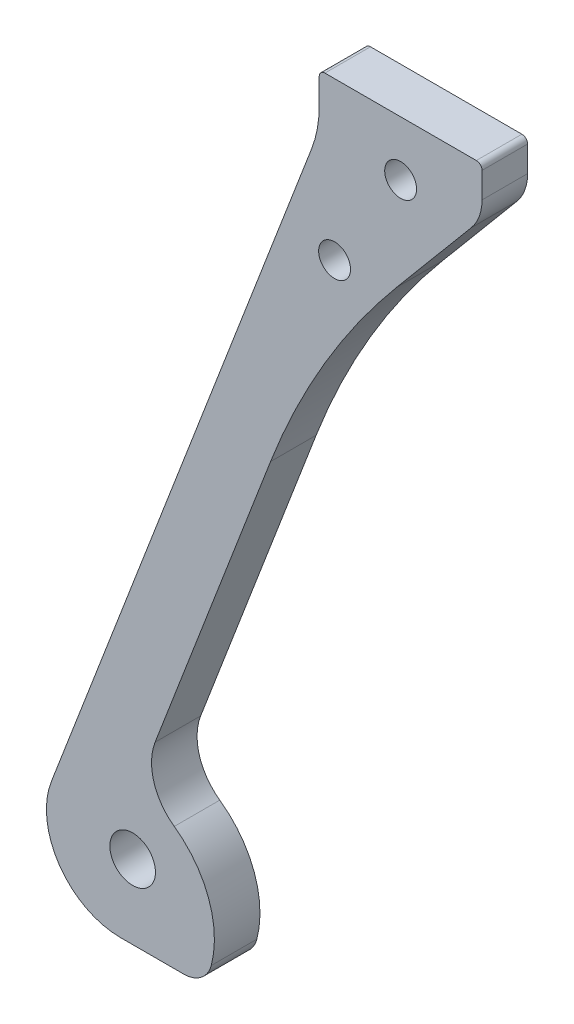
ISO-10303-21;
HEADER;
FILE_DESCRIPTION(('STEP AP214'),'2;1');
FILE_NAME('part.step','',(''),(''),'','','');
FILE_SCHEMA(('AUTOMOTIVE_DESIGN { 1 0 10303 214 1 1 1 1 }'));
ENDSEC;
DATA;
#1=APPLICATION_CONTEXT('core data for automotive mechanical design processes');
#2=APPLICATION_PROTOCOL_DEFINITION('international standard','automotive_design',2000,#1);
#3=PRODUCT_CONTEXT('',#1,'mechanical');
#4=PRODUCT('Part','Part','',(#3));
#5=PRODUCT_RELATED_PRODUCT_CATEGORY('part','',(#4));
#6=PRODUCT_DEFINITION_FORMATION('','',#4);
#7=PRODUCT_DEFINITION_CONTEXT('part definition',#1,'design');
#8=PRODUCT_DEFINITION('design','',#6,#7);
#9=PRODUCT_DEFINITION_SHAPE('','',#8);
#10=(LENGTH_UNIT() NAMED_UNIT(*) SI_UNIT(.MILLI.,.METRE.));
#11=(NAMED_UNIT(*) PLANE_ANGLE_UNIT() SI_UNIT($,.RADIAN.));
#12=(NAMED_UNIT(*) SI_UNIT($,.STERADIAN.) SOLID_ANGLE_UNIT());
#13=UNCERTAINTY_MEASURE_WITH_UNIT(LENGTH_MEASURE(1.E-05),#10,'distance_accuracy_value','');
#14=(GEOMETRIC_REPRESENTATION_CONTEXT(3) GLOBAL_UNCERTAINTY_ASSIGNED_CONTEXT((#13)) GLOBAL_UNIT_ASSIGNED_CONTEXT((#10,
#11,#12)) REPRESENTATION_CONTEXT('',''));
#15=CARTESIAN_POINT('',(0.,0.,0.));
#16=DIRECTION('',(0.,0.,1.));
#17=DIRECTION('',(1.,0.,0.));
#18=AXIS2_PLACEMENT_3D('',#15,#16,#17);
#19=CARTESIAN_POINT('',(-97.8739036875604,8.,4.));
#20=DIRECTION('',(0.,0.,1.));
#21=DIRECTION('',(1.,0.,0.));
#22=AXIS2_PLACEMENT_3D('',#19,#20,#21);
#23=PLANE('',#22);
#24=DIRECTION('',(0.,1.,0.));
#25=VECTOR('',#24,1.);
#26=CARTESIAN_POINT('',(-84.7280338220464,3.95234601413972,4.));
#27=LINE('',#26,#25);
#28=CARTESIAN_POINT('',(-84.7280338220463,-3.04765398586029,4.));
#29=VERTEX_POINT('',#28);
#30=CARTESIAN_POINT('',(-84.7280338220463,-0.799999999999999,4.));
#31=VERTEX_POINT('',#30);
#32=EDGE_CURVE('E197',#29,#31,#27,.T.);
#33=ORIENTED_EDGE('',*,*,#32,.T.);
#34=CARTESIAN_POINT('',(-85.2280338220463,-0.800000000000003,4.));
#35=DIRECTION('',(0.,0.,1.));
#36=DIRECTION('',(1.,0.,0.));
#37=AXIS2_PLACEMENT_3D('',#34,#35,#36);
#38=CIRCLE('',#37,0.5);
#39=CARTESIAN_POINT('',(-85.2280338220463,-0.300000000000003,4.));
#40=VERTEX_POINT('',#39);
#41=EDGE_CURVE('E261',#31,#40,#38,.T.);
#42=ORIENTED_EDGE('',*,*,#41,.T.);
#43=DIRECTION('',(1.,0.,0.));
#44=VECTOR('',#43,1.);
#45=CARTESIAN_POINT('',(-97.8739036875604,-0.300000000000003,4.));
#46=LINE('',#45,#44);
#47=CARTESIAN_POINT('',(-98.5197735530744,-0.300000000000003,4.));
#48=VERTEX_POINT('',#47);
#49=EDGE_CURVE('E280',#48,#40,#46,.T.);
#50=ORIENTED_EDGE('',*,*,#49,.F.);
#51=CARTESIAN_POINT('',(-98.5197735530744,-0.800000000000003,4.));
#52=DIRECTION('',(0.,0.,1.));
#53=DIRECTION('',(1.,0.,0.));
#54=AXIS2_PLACEMENT_3D('',#51,#52,#53);
#55=CIRCLE('',#54,0.5);
#56=CARTESIAN_POINT('',(-99.0197735530744,-0.799999999999999,4.));
#57=VERTEX_POINT('',#56);
#58=EDGE_CURVE('E158',#48,#57,#55,.T.);
#59=ORIENTED_EDGE('',*,*,#58,.T.);
#60=DIRECTION('',(0.,-1.,0.));
#61=VECTOR('',#60,1.);
#62=CARTESIAN_POINT('',(-99.0197735530744,3.95234601413972,4.));
#63=LINE('',#62,#61);
#64=CARTESIAN_POINT('',(-99.0197735530744,-3.04765398586029,4.));
#65=VERTEX_POINT('',#64);
#66=EDGE_CURVE('E149',#57,#65,#63,.T.);
#67=ORIENTED_EDGE('',*,*,#66,.T.);
#68=CARTESIAN_POINT('',(-109.019773553074,-3.04765398586029,4.));
#69=DIRECTION('',(0.,0.,-1.));
#70=DIRECTION('',(-1.,0.,0.));
#71=AXIS2_PLACEMENT_3D('',#68,#69,#70);
#72=CIRCLE('',#71,10.);
#73=CARTESIAN_POINT('',(-99.6839692881024,-6.6313334813133,4.));
#74=VERTEX_POINT('',#73);
#75=EDGE_CURVE('E154',#65,#74,#72,.T.);
#76=ORIENTED_EDGE('',*,*,#75,.T.);
#77=DIRECTION('',(-0.358367949545301,-0.933580426497202,0.));
#78=VECTOR('',#77,1.);
#79=CARTESIAN_POINT('',(-99.6839692881024,-6.6313334813133,4.));
#80=LINE('',#79,#78);
#81=CARTESIAN_POINT('',(-122.538955573817,-66.1706083279555,4.));
#82=VERTEX_POINT('',#81);
#83=EDGE_CURVE('E175',#74,#82,#80,.T.);
#84=ORIENTED_EDGE('',*,*,#83,.T.);
#85=CARTESIAN_POINT('',(-116.470682801585,-68.5,4.));
#86=DIRECTION('',(0.,0.,1.));
#87=DIRECTION('',(1.,0.,0.));
#88=AXIS2_PLACEMENT_3D('',#85,#86,#87);
#89=CIRCLE('',#88,6.5);
#90=CARTESIAN_POINT('',(-116.470682801585,-75.,4.));
#91=VERTEX_POINT('',#90);
#92=EDGE_CURVE('E177',#82,#91,#89,.T.);
#93=ORIENTED_EDGE('',*,*,#92,.T.);
#94=DIRECTION('',(1.,0.,0.));
#95=VECTOR('',#94,1.);
#96=CARTESIAN_POINT('',(-116.470682801585,-75.,4.));
#97=LINE('',#96,#95);
#98=CARTESIAN_POINT('',(-110.913984241029,-75.,4.));
#99=VERTEX_POINT('',#98);
#100=EDGE_CURVE('E182',#91,#99,#97,.T.);
#101=ORIENTED_EDGE('',*,*,#100,.T.);
#102=CARTESIAN_POINT('',(-110.913984241029,-72.5,4.));
#103=DIRECTION('',(0.,0.,1.));
#104=DIRECTION('',(1.,0.,0.));
#105=AXIS2_PLACEMENT_3D('',#102,#103,#104);
#106=CIRCLE('',#105,2.5);
#107=CARTESIAN_POINT('',(-108.495917326665,-73.134785316199,4.));
#108=VERTEX_POINT('',#107);
#109=EDGE_CURVE('E184',#99,#108,#106,.T.);
#110=ORIENTED_EDGE('',*,*,#109,.T.);
#111=CARTESIAN_POINT('',(-116.586415863519,-71.0108864110785,4.));
#112=DIRECTION('',(0.,0.,1.));
#113=DIRECTION('',(-1.,0.,0.));
#114=AXIS2_PLACEMENT_3D('',#111,#112,#113);
#115=CIRCLE('',#114,8.36463466829238);
#116=CARTESIAN_POINT('',(-111.747141559165,-64.188237560286,4.));
#117=VERTEX_POINT('',#116);
#118=EDGE_CURVE('E186',#108,#117,#115,.T.);
#119=ORIENTED_EDGE('',*,*,#118,.T.);
#120=CARTESIAN_POINT('',(-109.005459932499,-60.3228788674377,4.));
#121=DIRECTION('',(0.,0.,-1.));
#122=DIRECTION('',(1.,0.,0.));
#123=AXIS2_PLACEMENT_3D('',#120,#121,#122);
#124=CIRCLE('',#123,4.73896781655823);
#125=CARTESIAN_POINT('',(-113.429667527838,-58.6245846880566,4.));
#126=VERTEX_POINT('',#125);
#127=EDGE_CURVE('E188',#117,#126,#124,.T.);
#128=ORIENTED_EDGE('',*,*,#127,.T.);
#129=DIRECTION('',(0.3583679495453,0.933580426497202,0.));
#130=VECTOR('',#129,1.);
#131=CARTESIAN_POINT('',(-99.3383388404281,-21.9154184174788,4.));
#132=LINE('',#131,#130);
#133=CARTESIAN_POINT('',(-103.296373867841,-32.2264521850663,4.));
#134=VERTEX_POINT('',#133);
#135=EDGE_CURVE('E190',#126,#134,#132,.T.);
#136=ORIENTED_EDGE('',*,*,#135,.T.);
#137=CARTESIAN_POINT('',(-41.6800657190254,-55.8787368550561,4.));
#138=DIRECTION('',(0.,0.,1.));
#139=DIRECTION('',(1.,0.,0.));
#140=AXIS2_PLACEMENT_3D('',#137,#138,#139);
#141=CIRCLE('',#140,66.);
#142=CARTESIAN_POINT('',(-92.2389989648779,-13.4547546157445,4.));
#143=VERTEX_POINT('',#142);
#144=EDGE_CURVE('E255',#134,#143,#141,.F.);
#145=ORIENTED_EDGE('',*,*,#144,.T.);
#146=DIRECTION('',(0.64278760968654,0.766044443118977,0.));
#147=VECTOR('',#146,1.);
#148=CARTESIAN_POINT('',(-85.6638560495704,-5.61880442460645,4.));
#149=LINE('',#148,#147);
#150=CARTESIAN_POINT('',(-85.6638560495704,-5.61880442460646,4.));
#151=VERTEX_POINT('',#150);
#152=EDGE_CURVE('E193',#143,#151,#149,.T.);
#153=ORIENTED_EDGE('',*,*,#152,.T.);
#154=CARTESIAN_POINT('',(-88.7280338220463,-3.04765398586029,4.));
#155=DIRECTION('',(0.,0.,1.));
#156=DIRECTION('',(-1.,0.,0.));
#157=AXIS2_PLACEMENT_3D('',#154,#155,#156);
#158=CIRCLE('',#157,3.99999999999998);
#159=EDGE_CURVE('E195',#151,#29,#158,.T.);
#160=ORIENTED_EDGE('',*,*,#159,.T.);
#161=EDGE_LOOP('',(#33,#42,#50,#59,#67,#76,#84,#93,#101,#110,#119,#128,#136,#145,#153,#160));
#162=FACE_BOUND('',#161,.T.);
#163=CARTESIAN_POINT('',(-115.399537807948,-68.5,4.));
#164=DIRECTION('',(0.,0.,1.));
#165=DIRECTION('',(1.,0.,0.));
#166=AXIS2_PLACEMENT_3D('',#163,#164,#165);
#167=CIRCLE('',#166,2.);
#168=CARTESIAN_POINT('',(-113.399537807948,-68.5,4.));
#169=VERTEX_POINT('',#168);
#170=EDGE_CURVE('E292',#169,#169,#167,.T.);
#171=ORIENTED_EDGE('',*,*,#170,.F.);
#172=EDGE_LOOP('',(#171));
#173=FACE_BOUND('',#172,.T.);
#174=CARTESIAN_POINT('',(-97.6739036875604,-14.1,4.));
#175=DIRECTION('',(0.,0.,1.));
#176=DIRECTION('',(1.,0.,0.));
#177=AXIS2_PLACEMENT_3D('',#174,#175,#176);
#178=CIRCLE('',#177,1.4);
#179=CARTESIAN_POINT('',(-96.2739036875604,-14.1,4.));
#180=VERTEX_POINT('',#179);
#181=EDGE_CURVE('E202',#180,#180,#178,.T.);
#182=ORIENTED_EDGE('',*,*,#181,.F.);
#183=EDGE_LOOP('',(#182));
#184=FACE_BOUND('',#183,.T.);
#185=CARTESIAN_POINT('',(-91.8739036875604,-5.1,4.));
#186=DIRECTION('',(0.,0.,1.));
#187=DIRECTION('',(1.,0.,0.));
#188=AXIS2_PLACEMENT_3D('',#185,#186,#187);
#189=CIRCLE('',#188,1.4);
#190=CARTESIAN_POINT('',(-90.4739036875604,-5.1,4.));
#191=VERTEX_POINT('',#190);
#192=EDGE_CURVE('E285',#191,#191,#189,.T.);
#193=ORIENTED_EDGE('',*,*,#192,.F.);
#194=EDGE_LOOP('',(#193));
#195=FACE_BOUND('',#194,.T.);
#196=ADVANCED_FACE('F35',(#162,#173,#184,#195),#23,.T.);
#197=CARTESIAN_POINT('',(-97.8739036875604,8.,0.));
#198=DIRECTION('',(0.,0.,1.));
#199=DIRECTION('',(1.,0.,0.));
#200=AXIS2_PLACEMENT_3D('',#197,#198,#199);
#201=PLANE('',#200);
#202=DIRECTION('',(1.,0.,0.));
#203=VECTOR('',#202,1.);
#204=CARTESIAN_POINT('',(-100.67390368756,-0.300000000000003,0.));
#205=LINE('',#204,#203);
#206=CARTESIAN_POINT('',(-98.5197735530744,-0.300000000000003,0.));
#207=VERTEX_POINT('',#206);
#208=CARTESIAN_POINT('',(-85.2280338220463,-0.300000000000003,0.));
#209=VERTEX_POINT('',#208);
#210=EDGE_CURVE('E272',#207,#209,#205,.T.);
#211=ORIENTED_EDGE('',*,*,#210,.T.);
#212=CARTESIAN_POINT('',(-85.2280338220463,-0.800000000000003,0.));
#213=DIRECTION('',(0.,0.,1.));
#214=DIRECTION('',(1.,0.,0.));
#215=AXIS2_PLACEMENT_3D('',#212,#213,#214);
#216=CIRCLE('',#215,0.5);
#217=CARTESIAN_POINT('',(-84.7280338220463,-0.799999999999999,0.));
#218=VERTEX_POINT('',#217);
#219=EDGE_CURVE('E43',#209,#218,#216,.F.);
#220=ORIENTED_EDGE('',*,*,#219,.T.);
#221=DIRECTION('',(0.,1.,0.));
#222=VECTOR('',#221,1.);
#223=CARTESIAN_POINT('',(-84.7280338220464,3.95234601413972,0.));
#224=LINE('',#223,#222);
#225=CARTESIAN_POINT('',(-84.7280338220463,-3.04765398586029,0.));
#226=VERTEX_POINT('',#225);
#227=EDGE_CURVE('E160',#226,#218,#224,.T.);
#228=ORIENTED_EDGE('',*,*,#227,.F.);
#229=CARTESIAN_POINT('',(-88.7280338220463,-3.04765398586029,0.));
#230=DIRECTION('',(0.,0.,1.));
#231=DIRECTION('',(-1.,0.,0.));
#232=AXIS2_PLACEMENT_3D('',#229,#230,#231);
#233=CIRCLE('',#232,3.99999999999998);
#234=CARTESIAN_POINT('',(-85.6638560495704,-5.61880442460646,0.));
#235=VERTEX_POINT('',#234);
#236=EDGE_CURVE('E221',#235,#226,#233,.T.);
#237=ORIENTED_EDGE('',*,*,#236,.F.);
#238=DIRECTION('',(0.64278760968654,0.766044443118977,0.));
#239=VECTOR('',#238,1.);
#240=CARTESIAN_POINT('',(-85.6638560495704,-5.61880442460645,0.));
#241=LINE('',#240,#239);
#242=CARTESIAN_POINT('',(-92.2389989648779,-13.4547546157445,0.));
#243=VERTEX_POINT('',#242);
#244=EDGE_CURVE('E219',#243,#235,#241,.T.);
#245=ORIENTED_EDGE('',*,*,#244,.F.);
#246=CARTESIAN_POINT('',(-41.6800657190254,-55.8787368550561,0.));
#247=DIRECTION('',(0.,0.,1.));
#248=DIRECTION('',(1.,0.,0.));
#249=AXIS2_PLACEMENT_3D('',#246,#247,#248);
#250=CIRCLE('',#249,66.);
#251=CARTESIAN_POINT('',(-103.296373867841,-32.2264521850663,0.));
#252=VERTEX_POINT('',#251);
#253=EDGE_CURVE('E253',#243,#252,#250,.T.);
#254=ORIENTED_EDGE('',*,*,#253,.T.);
#255=DIRECTION('',(0.3583679495453,0.933580426497202,0.));
#256=VECTOR('',#255,1.);
#257=CARTESIAN_POINT('',(-99.3383388404281,-21.9154184174788,0.));
#258=LINE('',#257,#256);
#259=CARTESIAN_POINT('',(-113.429667527838,-58.6245846880566,0.));
#260=VERTEX_POINT('',#259);
#261=EDGE_CURVE('E216',#260,#252,#258,.T.);
#262=ORIENTED_EDGE('',*,*,#261,.F.);
#263=CARTESIAN_POINT('',(-109.005459932499,-60.3228788674377,0.));
#264=DIRECTION('',(0.,0.,-1.));
#265=DIRECTION('',(1.,0.,0.));
#266=AXIS2_PLACEMENT_3D('',#263,#264,#265);
#267=CIRCLE('',#266,4.73896781655823);
#268=CARTESIAN_POINT('',(-111.747141559165,-64.188237560286,0.));
#269=VERTEX_POINT('',#268);
#270=EDGE_CURVE('E214',#269,#260,#267,.T.);
#271=ORIENTED_EDGE('',*,*,#270,.F.);
#272=CARTESIAN_POINT('',(-116.586415863519,-71.0108864110785,0.));
#273=DIRECTION('',(0.,0.,1.));
#274=DIRECTION('',(-1.,0.,0.));
#275=AXIS2_PLACEMENT_3D('',#272,#273,#274);
#276=CIRCLE('',#275,8.36463466829238);
#277=CARTESIAN_POINT('',(-108.495917326665,-73.134785316199,0.));
#278=VERTEX_POINT('',#277);
#279=EDGE_CURVE('E212',#278,#269,#276,.T.);
#280=ORIENTED_EDGE('',*,*,#279,.F.);
#281=CARTESIAN_POINT('',(-110.913984241029,-72.5,0.));
#282=DIRECTION('',(0.,0.,1.));
#283=DIRECTION('',(1.,0.,0.));
#284=AXIS2_PLACEMENT_3D('',#281,#282,#283);
#285=CIRCLE('',#284,2.5);
#286=CARTESIAN_POINT('',(-110.913984241029,-75.,0.));
#287=VERTEX_POINT('',#286);
#288=EDGE_CURVE('E210',#287,#278,#285,.T.);
#289=ORIENTED_EDGE('',*,*,#288,.F.);
#290=DIRECTION('',(1.,0.,0.));
#291=VECTOR('',#290,1.);
#292=CARTESIAN_POINT('',(-116.470682801585,-75.,0.));
#293=LINE('',#292,#291);
#294=CARTESIAN_POINT('',(-116.470682801585,-75.,0.));
#295=VERTEX_POINT('',#294);
#296=EDGE_CURVE('E208',#295,#287,#293,.T.);
#297=ORIENTED_EDGE('',*,*,#296,.F.);
#298=CARTESIAN_POINT('',(-116.470682801585,-68.5,0.));
#299=DIRECTION('',(0.,0.,1.));
#300=DIRECTION('',(1.,0.,0.));
#301=AXIS2_PLACEMENT_3D('',#298,#299,#300);
#302=CIRCLE('',#301,6.5);
#303=CARTESIAN_POINT('',(-122.538955573817,-66.1706083279555,0.));
#304=VERTEX_POINT('',#303);
#305=EDGE_CURVE('E206',#304,#295,#302,.T.);
#306=ORIENTED_EDGE('',*,*,#305,.F.);
#307=DIRECTION('',(-0.358367949545301,-0.933580426497202,0.));
#308=VECTOR('',#307,1.);
#309=CARTESIAN_POINT('',(-99.6839692881024,-6.6313334813133,0.));
#310=LINE('',#309,#308);
#311=CARTESIAN_POINT('',(-99.6839692881024,-6.6313334813133,0.));
#312=VERTEX_POINT('',#311);
#313=EDGE_CURVE('E204',#312,#304,#310,.T.);
#314=ORIENTED_EDGE('',*,*,#313,.F.);
#315=CARTESIAN_POINT('',(-109.019773553074,-3.04765398586029,0.));
#316=DIRECTION('',(0.,0.,-1.));
#317=DIRECTION('',(-1.,0.,0.));
#318=AXIS2_PLACEMENT_3D('',#315,#316,#317);
#319=CIRCLE('',#318,10.);
#320=CARTESIAN_POINT('',(-99.0197735530744,-3.04765398586029,0.));
#321=VERTEX_POINT('',#320);
#322=EDGE_CURVE('E201',#321,#312,#319,.T.);
#323=ORIENTED_EDGE('',*,*,#322,.F.);
#324=DIRECTION('',(0.,-1.,0.));
#325=VECTOR('',#324,1.);
#326=CARTESIAN_POINT('',(-99.0197735530744,3.95234601413972,0.));
#327=LINE('',#326,#325);
#328=CARTESIAN_POINT('',(-99.0197735530744,-0.799999999999999,0.));
#329=VERTEX_POINT('',#328);
#330=EDGE_CURVE('E166',#329,#321,#327,.T.);
#331=ORIENTED_EDGE('',*,*,#330,.F.);
#332=CARTESIAN_POINT('',(-98.5197735530744,-0.800000000000003,0.));
#333=DIRECTION('',(0.,0.,1.));
#334=DIRECTION('',(1.,0.,0.));
#335=AXIS2_PLACEMENT_3D('',#332,#333,#334);
#336=CIRCLE('',#335,0.5);
#337=EDGE_CURVE('E50',#329,#207,#336,.F.);
#338=ORIENTED_EDGE('',*,*,#337,.T.);
#339=EDGE_LOOP('',(#211,#220,#228,#237,#245,#254,#262,#271,#280,#289,#297,#306,#314,#323,#331,#338));
#340=FACE_BOUND('',#339,.T.);
#341=CARTESIAN_POINT('',(-97.6739036875604,-14.1,0.));
#342=DIRECTION('',(0.,0.,1.));
#343=DIRECTION('',(1.,0.,0.));
#344=AXIS2_PLACEMENT_3D('',#341,#342,#343);
#345=CIRCLE('',#344,1.4);
#346=CARTESIAN_POINT('',(-96.2739036875604,-14.1,0.));
#347=VERTEX_POINT('',#346);
#348=EDGE_CURVE('E295',#347,#347,#345,.T.);
#349=ORIENTED_EDGE('',*,*,#348,.T.);
#350=EDGE_LOOP('',(#349));
#351=FACE_BOUND('',#350,.T.);
#352=CARTESIAN_POINT('',(-115.399537807948,-68.5,0.));
#353=DIRECTION('',(0.,0.,1.));
#354=DIRECTION('',(1.,0.,0.));
#355=AXIS2_PLACEMENT_3D('',#352,#353,#354);
#356=CIRCLE('',#355,2.);
#357=CARTESIAN_POINT('',(-113.399537807948,-68.5,0.));
#358=VERTEX_POINT('',#357);
#359=EDGE_CURVE('E290',#358,#358,#356,.T.);
#360=ORIENTED_EDGE('',*,*,#359,.T.);
#361=EDGE_LOOP('',(#360));
#362=FACE_BOUND('',#361,.T.);
#363=CARTESIAN_POINT('',(-91.8739036875604,-5.1,0.));
#364=DIRECTION('',(0.,0.,1.));
#365=DIRECTION('',(1.,0.,0.));
#366=AXIS2_PLACEMENT_3D('',#363,#364,#365);
#367=CIRCLE('',#366,1.4);
#368=CARTESIAN_POINT('',(-90.4739036875604,-5.1,0.));
#369=VERTEX_POINT('',#368);
#370=EDGE_CURVE('E282',#369,#369,#367,.T.);
#371=ORIENTED_EDGE('',*,*,#370,.T.);
#372=EDGE_LOOP('',(#371));
#373=FACE_BOUND('',#372,.T.);
#374=ADVANCED_FACE('F269',(#340,#351,#362,#373),#201,.F.);
#375=CARTESIAN_POINT('',(-99.0197735530744,3.95234601413972,4.));
#376=DIRECTION('',(1.,0.,0.));
#377=DIRECTION('',(0.,1.,0.));
#378=AXIS2_PLACEMENT_3D('',#375,#376,#377);
#379=PLANE('',#378);
#380=ORIENTED_EDGE('',*,*,#66,.F.);
#381=DIRECTION('',(0.,0.,-1.));
#382=VECTOR('',#381,1.);
#383=CARTESIAN_POINT('',(-99.0197735530744,-0.799999999999999,4.));
#384=LINE('',#383,#382);
#385=EDGE_CURVE('E11',#57,#329,#384,.T.);
#386=ORIENTED_EDGE('',*,*,#385,.T.);
#387=ORIENTED_EDGE('',*,*,#330,.T.);
#388=DIRECTION('',(0.,0.,-1.));
#389=VECTOR('',#388,1.);
#390=CARTESIAN_POINT('',(-99.0197735530744,-3.04765398586029,4.));
#391=LINE('',#390,#389);
#392=EDGE_CURVE('E163',#65,#321,#391,.T.);
#393=ORIENTED_EDGE('',*,*,#392,.F.);
#394=EDGE_LOOP('',(#380,#386,#387,#393));
#395=FACE_BOUND('',#394,.T.);
#396=ADVANCED_FACE('F164',(#395),#379,.F.);
#397=CARTESIAN_POINT('',(-109.019773553074,-3.04765398586029,4.));
#398=DIRECTION('',(0.,0.,-1.));
#399=DIRECTION('',(-1.,0.,0.));
#400=AXIS2_PLACEMENT_3D('',#397,#398,#399);
#401=CYLINDRICAL_SURFACE('',#400,10.);
#402=ORIENTED_EDGE('',*,*,#322,.T.);
#403=DIRECTION('',(0.,0.,-1.));
#404=VECTOR('',#403,1.);
#405=CARTESIAN_POINT('',(-99.6839692881024,-6.6313334813133,4.));
#406=LINE('',#405,#404);
#407=EDGE_CURVE('E170',#74,#312,#406,.T.);
#408=ORIENTED_EDGE('',*,*,#407,.F.);
#409=ORIENTED_EDGE('',*,*,#75,.F.);
#410=ORIENTED_EDGE('',*,*,#392,.T.);
#411=EDGE_LOOP('',(#402,#408,#409,#410));
#412=FACE_BOUND('',#411,.T.);
#413=ADVANCED_FACE('F172',(#412),#401,.F.);
#414=CARTESIAN_POINT('',(-99.6839692881024,-6.6313334813133,4.));
#415=DIRECTION('',(0.933580426497202,-0.358367949545301,0.));
#416=DIRECTION('',(0.358367949545301,0.933580426497202,0.));
#417=AXIS2_PLACEMENT_3D('',#414,#415,#416);
#418=PLANE('',#417);
#419=ORIENTED_EDGE('',*,*,#313,.T.);
#420=DIRECTION('',(0.,0.,-1.));
#421=VECTOR('',#420,1.);
#422=CARTESIAN_POINT('',(-122.538955573817,-66.1706083279555,4.));
#423=LINE('',#422,#421);
#424=EDGE_CURVE('E245',#82,#304,#423,.T.);
#425=ORIENTED_EDGE('',*,*,#424,.F.);
#426=ORIENTED_EDGE('',*,*,#83,.F.);
#427=ORIENTED_EDGE('',*,*,#407,.T.);
#428=EDGE_LOOP('',(#419,#425,#426,#427));
#429=FACE_BOUND('',#428,.T.);
#430=ADVANCED_FACE('F354',(#429),#418,.F.);
#431=CARTESIAN_POINT('',(-116.470682801585,-68.5,4.));
#432=DIRECTION('',(0.,0.,-1.));
#433=DIRECTION('',(-1.,0.,0.));
#434=AXIS2_PLACEMENT_3D('',#431,#432,#433);
#435=CYLINDRICAL_SURFACE('',#434,6.5);
#436=ORIENTED_EDGE('',*,*,#305,.T.);
#437=DIRECTION('',(0.,0.,-1.));
#438=VECTOR('',#437,1.);
#439=CARTESIAN_POINT('',(-116.470682801585,-75.,4.));
#440=LINE('',#439,#438);
#441=EDGE_CURVE('E242',#91,#295,#440,.T.);
#442=ORIENTED_EDGE('',*,*,#441,.F.);
#443=ORIENTED_EDGE('',*,*,#92,.F.);
#444=ORIENTED_EDGE('',*,*,#424,.T.);
#445=EDGE_LOOP('',(#436,#442,#443,#444));
#446=FACE_BOUND('',#445,.T.);
#447=ADVANCED_FACE('F350',(#446),#435,.T.);
#448=CARTESIAN_POINT('',(-116.470682801585,-75.,4.));
#449=DIRECTION('',(0.,1.,0.));
#450=DIRECTION('',(0.,0.,1.));
#451=AXIS2_PLACEMENT_3D('',#448,#449,#450);
#452=PLANE('',#451);
#453=ORIENTED_EDGE('',*,*,#296,.T.);
#454=DIRECTION('',(0.,0.,-1.));
#455=VECTOR('',#454,1.);
#456=CARTESIAN_POINT('',(-110.913984241029,-75.,4.));
#457=LINE('',#456,#455);
#458=EDGE_CURVE('E239',#99,#287,#457,.T.);
#459=ORIENTED_EDGE('',*,*,#458,.F.);
#460=ORIENTED_EDGE('',*,*,#100,.F.);
#461=ORIENTED_EDGE('',*,*,#441,.T.);
#462=EDGE_LOOP('',(#453,#459,#460,#461));
#463=FACE_BOUND('',#462,.T.);
#464=ADVANCED_FACE('F346',(#463),#452,.F.);
#465=CARTESIAN_POINT('',(-110.913984241029,-72.5,4.));
#466=DIRECTION('',(0.,0.,-1.));
#467=DIRECTION('',(-1.,0.,0.));
#468=AXIS2_PLACEMENT_3D('',#465,#466,#467);
#469=CYLINDRICAL_SURFACE('',#468,2.5);
#470=ORIENTED_EDGE('',*,*,#288,.T.);
#471=DIRECTION('',(0.,0.,-1.));
#472=VECTOR('',#471,1.);
#473=CARTESIAN_POINT('',(-108.495917326665,-73.134785316199,4.));
#474=LINE('',#473,#472);
#475=EDGE_CURVE('E236',#108,#278,#474,.T.);
#476=ORIENTED_EDGE('',*,*,#475,.F.);
#477=ORIENTED_EDGE('',*,*,#109,.F.);
#478=ORIENTED_EDGE('',*,*,#458,.T.);
#479=EDGE_LOOP('',(#470,#476,#477,#478));
#480=FACE_BOUND('',#479,.T.);
#481=ADVANCED_FACE('F342',(#480),#469,.T.);
#482=CARTESIAN_POINT('',(-116.586415863519,-71.0108864110785,4.));
#483=DIRECTION('',(0.,0.,-1.));
#484=DIRECTION('',(-1.,0.,0.));
#485=AXIS2_PLACEMENT_3D('',#482,#483,#484);
#486=CYLINDRICAL_SURFACE('',#485,8.36463466829238);
#487=ORIENTED_EDGE('',*,*,#279,.T.);
#488=DIRECTION('',(0.,0.,-1.));
#489=VECTOR('',#488,1.);
#490=CARTESIAN_POINT('',(-111.747141559165,-64.188237560286,4.));
#491=LINE('',#490,#489);
#492=EDGE_CURVE('E233',#117,#269,#491,.T.);
#493=ORIENTED_EDGE('',*,*,#492,.F.);
#494=ORIENTED_EDGE('',*,*,#118,.F.);
#495=ORIENTED_EDGE('',*,*,#475,.T.);
#496=EDGE_LOOP('',(#487,#493,#494,#495));
#497=FACE_BOUND('',#496,.T.);
#498=ADVANCED_FACE('F338',(#497),#486,.T.);
#499=CARTESIAN_POINT('',(-109.005459932499,-60.3228788674377,4.));
#500=DIRECTION('',(0.,0.,-1.));
#501=DIRECTION('',(-1.,0.,0.));
#502=AXIS2_PLACEMENT_3D('',#499,#500,#501);
#503=CYLINDRICAL_SURFACE('',#502,4.73896781655823);
#504=ORIENTED_EDGE('',*,*,#270,.T.);
#505=DIRECTION('',(0.,0.,-1.));
#506=VECTOR('',#505,1.);
#507=CARTESIAN_POINT('',(-113.429667527838,-58.6245846880566,4.));
#508=LINE('',#507,#506);
#509=EDGE_CURVE('E230',#126,#260,#508,.T.);
#510=ORIENTED_EDGE('',*,*,#509,.F.);
#511=ORIENTED_EDGE('',*,*,#127,.F.);
#512=ORIENTED_EDGE('',*,*,#492,.T.);
#513=EDGE_LOOP('',(#504,#510,#511,#512));
#514=FACE_BOUND('',#513,.T.);
#515=ADVANCED_FACE('F334',(#514),#503,.F.);
#516=CARTESIAN_POINT('',(-99.3383388404281,-21.9154184174788,4.));
#517=DIRECTION('',(-0.933580426497202,0.3583679495453,0.));
#518=DIRECTION('',(-0.3583679495453,-0.933580426497202,0.));
#519=AXIS2_PLACEMENT_3D('',#516,#517,#518);
#520=PLANE('',#519);
#521=ORIENTED_EDGE('',*,*,#261,.T.);
#522=DIRECTION('',(0.,0.,-1.));
#523=VECTOR('',#522,1.);
#524=CARTESIAN_POINT('',(-103.296373867841,-32.2264521850663,4.));
#525=LINE('',#524,#523);
#526=EDGE_CURVE('E251',#252,#134,#525,.F.);
#527=ORIENTED_EDGE('',*,*,#526,.T.);
#528=ORIENTED_EDGE('',*,*,#135,.F.);
#529=ORIENTED_EDGE('',*,*,#509,.T.);
#530=EDGE_LOOP('',(#521,#527,#528,#529));
#531=FACE_BOUND('',#530,.T.);
#532=ADVANCED_FACE('F330',(#531),#520,.F.);
#533=CARTESIAN_POINT('',(-85.6638560495704,-5.61880442460645,4.));
#534=DIRECTION('',(-0.766044443118977,0.64278760968654,0.));
#535=DIRECTION('',(-0.64278760968654,-0.766044443118977,0.));
#536=AXIS2_PLACEMENT_3D('',#533,#534,#535);
#537=PLANE('',#536);
#538=ORIENTED_EDGE('',*,*,#152,.F.);
#539=DIRECTION('',(0.,0.,-1.));
#540=VECTOR('',#539,1.);
#541=CARTESIAN_POINT('',(-92.2389989648779,-13.4547546157445,0.));
#542=LINE('',#541,#540);
#543=EDGE_CURVE('E169',#143,#243,#542,.T.);
#544=ORIENTED_EDGE('',*,*,#543,.T.);
#545=ORIENTED_EDGE('',*,*,#244,.T.);
#546=DIRECTION('',(0.,0.,-1.));
#547=VECTOR('',#546,1.);
#548=CARTESIAN_POINT('',(-85.6638560495704,-5.61880442460646,4.));
#549=LINE('',#548,#547);
#550=EDGE_CURVE('E227',#151,#235,#549,.T.);
#551=ORIENTED_EDGE('',*,*,#550,.F.);
#552=EDGE_LOOP('',(#538,#544,#545,#551));
#553=FACE_BOUND('',#552,.T.);
#554=ADVANCED_FACE('F326',(#553),#537,.F.);
#555=CARTESIAN_POINT('',(-88.7280338220463,-3.04765398586029,4.));
#556=DIRECTION('',(0.,0.,-1.));
#557=DIRECTION('',(-1.,0.,0.));
#558=AXIS2_PLACEMENT_3D('',#555,#556,#557);
#559=CYLINDRICAL_SURFACE('',#558,3.99999999999998);
#560=ORIENTED_EDGE('',*,*,#236,.T.);
#561=DIRECTION('',(0.,0.,-1.));
#562=VECTOR('',#561,1.);
#563=CARTESIAN_POINT('',(-84.7280338220463,-3.04765398586029,4.));
#564=LINE('',#563,#562);
#565=EDGE_CURVE('E199',#29,#226,#564,.T.);
#566=ORIENTED_EDGE('',*,*,#565,.F.);
#567=ORIENTED_EDGE('',*,*,#159,.F.);
#568=ORIENTED_EDGE('',*,*,#550,.T.);
#569=EDGE_LOOP('',(#560,#566,#567,#568));
#570=FACE_BOUND('',#569,.T.);
#571=ADVANCED_FACE('F315',(#570),#559,.T.);
#572=CARTESIAN_POINT('',(-84.7280338220464,3.95234601413972,4.));
#573=DIRECTION('',(-1.,0.,0.));
#574=DIRECTION('',(0.,-1.,0.));
#575=AXIS2_PLACEMENT_3D('',#572,#573,#574);
#576=PLANE('',#575);
#577=ORIENTED_EDGE('',*,*,#227,.T.);
#578=DIRECTION('',(0.,0.,1.));
#579=VECTOR('',#578,1.);
#580=CARTESIAN_POINT('',(-84.7280338220463,-0.799999999999999,4.));
#581=LINE('',#580,#579);
#582=EDGE_CURVE('E257',#218,#31,#581,.T.);
#583=ORIENTED_EDGE('',*,*,#582,.T.);
#584=ORIENTED_EDGE('',*,*,#32,.F.);
#585=ORIENTED_EDGE('',*,*,#565,.T.);
#586=EDGE_LOOP('',(#577,#583,#584,#585));
#587=FACE_BOUND('',#586,.T.);
#588=ADVANCED_FACE('F276',(#587),#576,.F.);
#589=CARTESIAN_POINT('',(-97.6739036875604,-14.1,4.));
#590=DIRECTION('',(0.,0.,-1.));
#591=DIRECTION('',(-1.,0.,0.));
#592=AXIS2_PLACEMENT_3D('',#589,#590,#591);
#593=CYLINDRICAL_SURFACE('',#592,1.4);
#594=ORIENTED_EDGE('',*,*,#181,.T.);
#595=EDGE_LOOP('',(#594));
#596=FACE_BOUND('',#595,.T.);
#597=ORIENTED_EDGE('',*,*,#348,.F.);
#598=EDGE_LOOP('',(#597));
#599=FACE_BOUND('',#598,.T.);
#600=ADVANCED_FACE('F303',(#596,#599),#593,.F.);
#601=CARTESIAN_POINT('',(-115.399537807948,-68.5,4.));
#602=DIRECTION('',(0.,0.,-1.));
#603=DIRECTION('',(-1.,0.,0.));
#604=AXIS2_PLACEMENT_3D('',#601,#602,#603);
#605=CYLINDRICAL_SURFACE('',#604,2.);
#606=ORIENTED_EDGE('',*,*,#170,.T.);
#607=EDGE_LOOP('',(#606));
#608=FACE_BOUND('',#607,.T.);
#609=ORIENTED_EDGE('',*,*,#359,.F.);
#610=EDGE_LOOP('',(#609));
#611=FACE_BOUND('',#610,.T.);
#612=ADVANCED_FACE('F305',(#608,#611),#605,.F.);
#613=CARTESIAN_POINT('',(-91.8739036875604,-5.1,4.));
#614=DIRECTION('',(0.,0.,-1.));
#615=DIRECTION('',(-1.,0.,0.));
#616=AXIS2_PLACEMENT_3D('',#613,#614,#615);
#617=CYLINDRICAL_SURFACE('',#616,1.4);
#618=ORIENTED_EDGE('',*,*,#192,.T.);
#619=EDGE_LOOP('',(#618));
#620=FACE_BOUND('',#619,.T.);
#621=ORIENTED_EDGE('',*,*,#370,.F.);
#622=EDGE_LOOP('',(#621));
#623=FACE_BOUND('',#622,.T.);
#624=ADVANCED_FACE('F312',(#620,#623),#617,.F.);
#625=CARTESIAN_POINT('',(-41.6800657190254,-55.8787368550561,4.));
#626=DIRECTION('',(0.,0.,1.));
#627=DIRECTION('',(1.,0.,0.));
#628=AXIS2_PLACEMENT_3D('',#625,#626,#627);
#629=CYLINDRICAL_SURFACE('',#628,66.);
#630=ORIENTED_EDGE('',*,*,#144,.F.);
#631=ORIENTED_EDGE('',*,*,#526,.F.);
#632=ORIENTED_EDGE('',*,*,#253,.F.);
#633=ORIENTED_EDGE('',*,*,#543,.F.);
#634=EDGE_LOOP('',(#630,#631,#632,#633));
#635=FACE_BOUND('',#634,.T.);
#636=ADVANCED_FACE('F363',(#635),#629,.F.);
#637=CARTESIAN_POINT('',(-100.67390368756,-0.300000000000003,0.));
#638=DIRECTION('',(0.,-1.,0.));
#639=DIRECTION('',(0.,0.,-1.));
#640=AXIS2_PLACEMENT_3D('',#637,#638,#639);
#641=PLANE('',#640);
#642=ORIENTED_EDGE('',*,*,#49,.T.);
#643=DIRECTION('',(0.,0.,1.));
#644=VECTOR('',#643,1.);
#645=CARTESIAN_POINT('',(-85.2280338220463,-0.300000000000003,0.));
#646=LINE('',#645,#644);
#647=EDGE_CURVE('E57',#40,#209,#646,.F.);
#648=ORIENTED_EDGE('',*,*,#647,.T.);
#649=ORIENTED_EDGE('',*,*,#210,.F.);
#650=DIRECTION('',(0.,0.,-1.));
#651=VECTOR('',#650,1.);
#652=CARTESIAN_POINT('',(-98.5197735530744,-0.300000000000003,0.));
#653=LINE('',#652,#651);
#654=EDGE_CURVE('E263',#207,#48,#653,.F.);
#655=ORIENTED_EDGE('',*,*,#654,.T.);
#656=EDGE_LOOP('',(#642,#648,#649,#655));
#657=FACE_BOUND('',#656,.T.);
#658=ADVANCED_FACE('F281',(#657),#641,.F.);
#659=CARTESIAN_POINT('',(-85.2280338220463,-0.800000000000003,4.));
#660=DIRECTION('',(0.,0.,1.));
#661=DIRECTION('',(1.,0.,0.));
#662=AXIS2_PLACEMENT_3D('',#659,#660,#661);
#663=CYLINDRICAL_SURFACE('',#662,0.5);
#664=ORIENTED_EDGE('',*,*,#219,.F.);
#665=ORIENTED_EDGE('',*,*,#647,.F.);
#666=ORIENTED_EDGE('',*,*,#41,.F.);
#667=ORIENTED_EDGE('',*,*,#582,.F.);
#668=EDGE_LOOP('',(#664,#665,#666,#667));
#669=FACE_BOUND('',#668,.T.);
#670=ADVANCED_FACE('F279',(#669),#663,.T.);
#671=CARTESIAN_POINT('',(-98.5197735530744,-0.800000000000003,4.));
#672=DIRECTION('',(0.,0.,-1.));
#673=DIRECTION('',(-1.,0.,0.));
#674=AXIS2_PLACEMENT_3D('',#671,#672,#673);
#675=CYLINDRICAL_SURFACE('',#674,0.5);
#676=ORIENTED_EDGE('',*,*,#58,.F.);
#677=ORIENTED_EDGE('',*,*,#654,.F.);
#678=ORIENTED_EDGE('',*,*,#337,.F.);
#679=ORIENTED_EDGE('',*,*,#385,.F.);
#680=EDGE_LOOP('',(#676,#677,#678,#679));
#681=FACE_BOUND('',#680,.T.);
#682=ADVANCED_FACE('F37',(#681),#675,.T.);
#683=CLOSED_SHELL('',(#196,#374,#396,#413,#430,#447,#464,#481,#498,#515,#532,#554,#571,#588,
#600,#612,#624,#636,#658,#670,#682));
#684=MANIFOLD_SOLID_BREP('B2',#683);
#685=ADVANCED_BREP_SHAPE_REPRESENTATION('',(#18,#684),#14);
#686=SHAPE_DEFINITION_REPRESENTATION(#9,#685);
ENDSEC;
END-ISO-10303-21;
